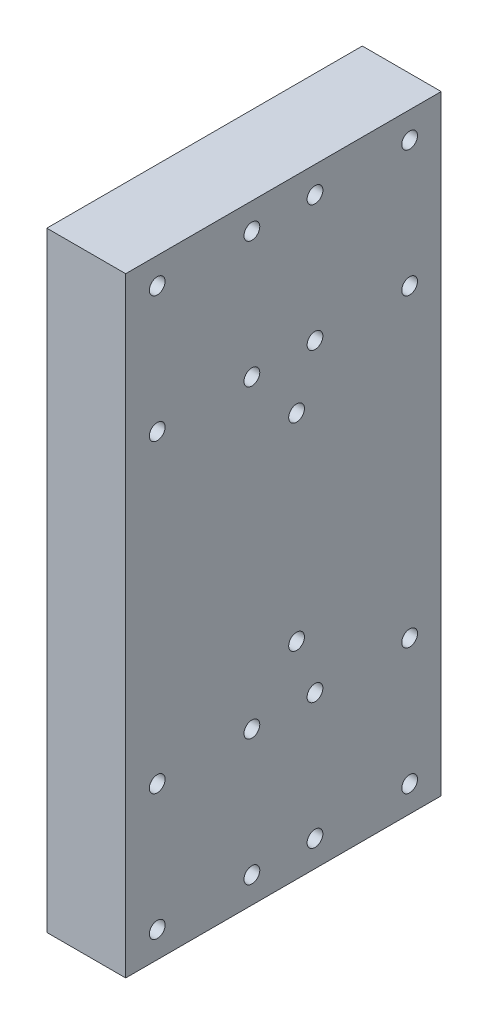
ISO-10303-21;
HEADER;
FILE_DESCRIPTION(('STEP AP214'),'2;1');
FILE_NAME('part.step','',(''),(''),'','','');
FILE_SCHEMA(('AUTOMOTIVE_DESIGN { 1 0 10303 214 1 1 1 1 }'));
ENDSEC;
DATA;
#1=APPLICATION_CONTEXT('core data for automotive mechanical design processes');
#2=APPLICATION_PROTOCOL_DEFINITION('international standard','automotive_design',2000,#1);
#3=PRODUCT_CONTEXT('',#1,'mechanical');
#4=PRODUCT('Part','Part','',(#3));
#5=PRODUCT_RELATED_PRODUCT_CATEGORY('part','',(#4));
#6=PRODUCT_DEFINITION_FORMATION('','',#4);
#7=PRODUCT_DEFINITION_CONTEXT('part definition',#1,'design');
#8=PRODUCT_DEFINITION('design','',#6,#7);
#9=PRODUCT_DEFINITION_SHAPE('','',#8);
#10=(LENGTH_UNIT() NAMED_UNIT(*) SI_UNIT(.MILLI.,.METRE.));
#11=(NAMED_UNIT(*) PLANE_ANGLE_UNIT() SI_UNIT($,.RADIAN.));
#12=(NAMED_UNIT(*) SI_UNIT($,.STERADIAN.) SOLID_ANGLE_UNIT());
#13=UNCERTAINTY_MEASURE_WITH_UNIT(LENGTH_MEASURE(1.E-05),#10,'distance_accuracy_value','');
#14=(GEOMETRIC_REPRESENTATION_CONTEXT(3) GLOBAL_UNCERTAINTY_ASSIGNED_CONTEXT((#13)) GLOBAL_UNIT_ASSIGNED_CONTEXT((#10,
#11,#12)) REPRESENTATION_CONTEXT('',''));
#15=CARTESIAN_POINT('',(0.,0.,0.));
#16=DIRECTION('',(0.,0.,1.));
#17=DIRECTION('',(1.,0.,0.));
#18=AXIS2_PLACEMENT_3D('',#15,#16,#17);
#19=CARTESIAN_POINT('',(15.,0.,0.));
#20=DIRECTION('',(-1.,0.,0.));
#21=DIRECTION('',(0.,0.,1.));
#22=AXIS2_PLACEMENT_3D('',#19,#20,#21);
#23=PLANE('',#22);
#24=CARTESIAN_POINT('',(15.,76.8,-32.5));
#25=DIRECTION('',(1.,0.,0.));
#26=DIRECTION('',(0.,0.,-1.));
#27=AXIS2_PLACEMENT_3D('',#24,#25,#26);
#28=CIRCLE('',#27,1.5);
#29=CARTESIAN_POINT('',(15.,76.8,-34.));
#30=VERTEX_POINT('',#29);
#31=EDGE_CURVE('E205',#30,#30,#28,.T.);
#32=ORIENTED_EDGE('',*,*,#31,.F.);
#33=EDGE_LOOP('',(#32));
#34=FACE_BOUND('',#33,.T.);
#35=CARTESIAN_POINT('',(15.,111.,-54.));
#36=DIRECTION('',(1.,0.,0.));
#37=DIRECTION('',(0.,0.,1.));
#38=AXIS2_PLACEMENT_3D('',#35,#36,#37);
#39=CIRCLE('',#38,1.5);
#40=CARTESIAN_POINT('',(15.,111.,-52.5));
#41=VERTEX_POINT('',#40);
#42=EDGE_CURVE('E193',#41,#41,#39,.T.);
#43=ORIENTED_EDGE('',*,*,#42,.F.);
#44=EDGE_LOOP('',(#43));
#45=FACE_BOUND('',#44,.T.);
#46=CARTESIAN_POINT('',(15.,87.,-36.));
#47=DIRECTION('',(1.,0.,0.));
#48=DIRECTION('',(0.,0.,1.));
#49=AXIS2_PLACEMENT_3D('',#46,#47,#48);
#50=CIRCLE('',#49,1.5);
#51=CARTESIAN_POINT('',(15.,87.,-34.5));
#52=VERTEX_POINT('',#51);
#53=EDGE_CURVE('E181',#52,#52,#50,.T.);
#54=ORIENTED_EDGE('',*,*,#53,.F.);
#55=EDGE_LOOP('',(#54));
#56=FACE_BOUND('',#55,.T.);
#57=CARTESIAN_POINT('',(15.,111.,-24.));
#58=DIRECTION('',(1.,0.,0.));
#59=DIRECTION('',(0.,0.,-1.));
#60=AXIS2_PLACEMENT_3D('',#57,#58,#59);
#61=CIRCLE('',#60,1.5);
#62=CARTESIAN_POINT('',(15.,111.,-25.5));
#63=VERTEX_POINT('',#62);
#64=EDGE_CURVE('E169',#63,#63,#61,.T.);
#65=ORIENTED_EDGE('',*,*,#64,.F.);
#66=EDGE_LOOP('',(#65));
#67=FACE_BOUND('',#66,.T.);
#68=CARTESIAN_POINT('',(15.,87.,-6.));
#69=DIRECTION('',(1.,0.,0.));
#70=DIRECTION('',(0.,0.,-1.));
#71=AXIS2_PLACEMENT_3D('',#68,#69,#70);
#72=CIRCLE('',#71,1.5);
#73=CARTESIAN_POINT('',(15.,87.,-7.5));
#74=VERTEX_POINT('',#73);
#75=EDGE_CURVE('E157',#74,#74,#72,.T.);
#76=ORIENTED_EDGE('',*,*,#75,.F.);
#77=EDGE_LOOP('',(#76));
#78=FACE_BOUND('',#77,.T.);
#79=CARTESIAN_POINT('',(15.,5.,-6.));
#80=DIRECTION('',(1.,0.,0.));
#81=DIRECTION('',(0.,0.,1.));
#82=AXIS2_PLACEMENT_3D('',#79,#80,#81);
#83=CIRCLE('',#82,1.5);
#84=CARTESIAN_POINT('',(15.,5.,-4.49999999999999));
#85=VERTEX_POINT('',#84);
#86=EDGE_CURVE('E145',#85,#85,#83,.T.);
#87=ORIENTED_EDGE('',*,*,#86,.F.);
#88=EDGE_LOOP('',(#87));
#89=FACE_BOUND('',#88,.T.);
#90=CARTESIAN_POINT('',(15.,29.,-24.));
#91=DIRECTION('',(1.,0.,0.));
#92=DIRECTION('',(0.,0.,1.));
#93=AXIS2_PLACEMENT_3D('',#90,#91,#92);
#94=CIRCLE('',#93,1.5);
#95=CARTESIAN_POINT('',(15.,29.,-22.5));
#96=VERTEX_POINT('',#95);
#97=EDGE_CURVE('E133',#96,#96,#94,.T.);
#98=ORIENTED_EDGE('',*,*,#97,.F.);
#99=EDGE_LOOP('',(#98));
#100=FACE_BOUND('',#99,.T.);
#101=CARTESIAN_POINT('',(15.,29.,-36.));
#102=DIRECTION('',(1.,0.,0.));
#103=DIRECTION('',(0.,0.,-1.));
#104=AXIS2_PLACEMENT_3D('',#101,#102,#103);
#105=CIRCLE('',#104,1.5);
#106=CARTESIAN_POINT('',(15.,29.,-37.5));
#107=VERTEX_POINT('',#106);
#108=EDGE_CURVE('E121',#107,#107,#105,.T.);
#109=ORIENTED_EDGE('',*,*,#108,.F.);
#110=EDGE_LOOP('',(#109));
#111=FACE_BOUND('',#110,.T.);
#112=CARTESIAN_POINT('',(15.,5.,-54.));
#113=DIRECTION('',(1.,0.,0.));
#114=DIRECTION('',(0.,0.,-1.));
#115=AXIS2_PLACEMENT_3D('',#112,#113,#114);
#116=CIRCLE('',#115,1.5);
#117=CARTESIAN_POINT('',(15.,5.,-55.5));
#118=VERTEX_POINT('',#117);
#119=EDGE_CURVE('E100',#118,#118,#116,.T.);
#120=ORIENTED_EDGE('',*,*,#119,.F.);
#121=EDGE_LOOP('',(#120));
#122=FACE_BOUND('',#121,.T.);
#123=DIRECTION('',(0.,-1.,0.));
#124=VECTOR('',#123,1.);
#125=CARTESIAN_POINT('',(15.,0.,0.));
#126=LINE('',#125,#124);
#127=CARTESIAN_POINT('',(15.,116.,0.));
#128=VERTEX_POINT('',#127);
#129=CARTESIAN_POINT('',(15.,0.,0.));
#130=VERTEX_POINT('',#129);
#131=EDGE_CURVE('E85',#128,#130,#126,.T.);
#132=ORIENTED_EDGE('',*,*,#131,.T.);
#133=DIRECTION('',(0.,0.,-1.));
#134=VECTOR('',#133,1.);
#135=CARTESIAN_POINT('',(15.,0.,0.));
#136=LINE('',#135,#134);
#137=CARTESIAN_POINT('',(15.,0.,-60.));
#138=VERTEX_POINT('',#137);
#139=EDGE_CURVE('E80',#130,#138,#136,.T.);
#140=ORIENTED_EDGE('',*,*,#139,.T.);
#141=DIRECTION('',(0.,1.,0.));
#142=VECTOR('',#141,1.);
#143=CARTESIAN_POINT('',(15.,0.,-60.));
#144=LINE('',#143,#142);
#145=CARTESIAN_POINT('',(15.,116.,-60.));
#146=VERTEX_POINT('',#145);
#147=EDGE_CURVE('E83',#138,#146,#144,.T.);
#148=ORIENTED_EDGE('',*,*,#147,.T.);
#149=DIRECTION('',(0.,0.,1.));
#150=VECTOR('',#149,1.);
#151=CARTESIAN_POINT('',(15.,116.,0.));
#152=LINE('',#151,#150);
#153=EDGE_CURVE('E50',#146,#128,#152,.T.);
#154=ORIENTED_EDGE('',*,*,#153,.T.);
#155=EDGE_LOOP('',(#132,#140,#148,#154));
#156=FACE_BOUND('',#155,.T.);
#157=CARTESIAN_POINT('',(15.,5.,-36.));
#158=DIRECTION('',(1.,0.,0.));
#159=DIRECTION('',(0.,0.,-1.));
#160=AXIS2_PLACEMENT_3D('',#157,#158,#159);
#161=CIRCLE('',#160,1.5);
#162=CARTESIAN_POINT('',(15.,5.,-37.5));
#163=VERTEX_POINT('',#162);
#164=EDGE_CURVE('E115',#163,#163,#161,.T.);
#165=ORIENTED_EDGE('',*,*,#164,.F.);
#166=EDGE_LOOP('',(#165));
#167=FACE_BOUND('',#166,.T.);
#168=CARTESIAN_POINT('',(15.,29.,-54.));
#169=DIRECTION('',(1.,0.,0.));
#170=DIRECTION('',(0.,0.,-1.));
#171=AXIS2_PLACEMENT_3D('',#168,#169,#170);
#172=CIRCLE('',#171,1.5);
#173=CARTESIAN_POINT('',(15.,29.,-55.5));
#174=VERTEX_POINT('',#173);
#175=EDGE_CURVE('E127',#174,#174,#172,.T.);
#176=ORIENTED_EDGE('',*,*,#175,.F.);
#177=EDGE_LOOP('',(#176));
#178=FACE_BOUND('',#177,.T.);
#179=CARTESIAN_POINT('',(15.,5.,-24.));
#180=DIRECTION('',(1.,0.,0.));
#181=DIRECTION('',(0.,0.,1.));
#182=AXIS2_PLACEMENT_3D('',#179,#180,#181);
#183=CIRCLE('',#182,1.5);
#184=CARTESIAN_POINT('',(15.,5.,-22.5));
#185=VERTEX_POINT('',#184);
#186=EDGE_CURVE('E139',#185,#185,#183,.T.);
#187=ORIENTED_EDGE('',*,*,#186,.F.);
#188=EDGE_LOOP('',(#187));
#189=FACE_BOUND('',#188,.T.);
#190=CARTESIAN_POINT('',(15.,29.,-6.));
#191=DIRECTION('',(1.,0.,0.));
#192=DIRECTION('',(0.,0.,1.));
#193=AXIS2_PLACEMENT_3D('',#190,#191,#192);
#194=CIRCLE('',#193,1.5);
#195=CARTESIAN_POINT('',(15.,29.,-4.49999999999999));
#196=VERTEX_POINT('',#195);
#197=EDGE_CURVE('E151',#196,#196,#194,.T.);
#198=ORIENTED_EDGE('',*,*,#197,.F.);
#199=EDGE_LOOP('',(#198));
#200=FACE_BOUND('',#199,.T.);
#201=CARTESIAN_POINT('',(15.,111.,-6.));
#202=DIRECTION('',(1.,0.,0.));
#203=DIRECTION('',(0.,0.,-1.));
#204=AXIS2_PLACEMENT_3D('',#201,#202,#203);
#205=CIRCLE('',#204,1.5);
#206=CARTESIAN_POINT('',(15.,111.,-7.5));
#207=VERTEX_POINT('',#206);
#208=EDGE_CURVE('E163',#207,#207,#205,.T.);
#209=ORIENTED_EDGE('',*,*,#208,.F.);
#210=EDGE_LOOP('',(#209));
#211=FACE_BOUND('',#210,.T.);
#212=CARTESIAN_POINT('',(15.,87.,-24.));
#213=DIRECTION('',(1.,0.,0.));
#214=DIRECTION('',(0.,0.,-1.));
#215=AXIS2_PLACEMENT_3D('',#212,#213,#214);
#216=CIRCLE('',#215,1.5);
#217=CARTESIAN_POINT('',(15.,87.,-25.5));
#218=VERTEX_POINT('',#217);
#219=EDGE_CURVE('E175',#218,#218,#216,.T.);
#220=ORIENTED_EDGE('',*,*,#219,.F.);
#221=EDGE_LOOP('',(#220));
#222=FACE_BOUND('',#221,.T.);
#223=CARTESIAN_POINT('',(15.,111.,-36.));
#224=DIRECTION('',(1.,0.,0.));
#225=DIRECTION('',(0.,0.,1.));
#226=AXIS2_PLACEMENT_3D('',#223,#224,#225);
#227=CIRCLE('',#226,1.5);
#228=CARTESIAN_POINT('',(15.,111.,-34.5));
#229=VERTEX_POINT('',#228);
#230=EDGE_CURVE('E187',#229,#229,#227,.T.);
#231=ORIENTED_EDGE('',*,*,#230,.F.);
#232=EDGE_LOOP('',(#231));
#233=FACE_BOUND('',#232,.T.);
#234=CARTESIAN_POINT('',(15.,87.,-54.));
#235=DIRECTION('',(1.,0.,0.));
#236=DIRECTION('',(0.,0.,1.));
#237=AXIS2_PLACEMENT_3D('',#234,#235,#236);
#238=CIRCLE('',#237,1.5);
#239=CARTESIAN_POINT('',(15.,87.,-52.5));
#240=VERTEX_POINT('',#239);
#241=EDGE_CURVE('E199',#240,#240,#238,.T.);
#242=ORIENTED_EDGE('',*,*,#241,.F.);
#243=EDGE_LOOP('',(#242));
#244=FACE_BOUND('',#243,.T.);
#245=CARTESIAN_POINT('',(15.,39.2,-32.5));
#246=DIRECTION('',(1.,0.,0.));
#247=DIRECTION('',(0.,0.,-1.));
#248=AXIS2_PLACEMENT_3D('',#245,#246,#247);
#249=CIRCLE('',#248,1.5);
#250=CARTESIAN_POINT('',(15.,39.2,-34.));
#251=VERTEX_POINT('',#250);
#252=EDGE_CURVE('E211',#251,#251,#249,.T.);
#253=ORIENTED_EDGE('',*,*,#252,.F.);
#254=EDGE_LOOP('',(#253));
#255=FACE_BOUND('',#254,.T.);
#256=ADVANCED_FACE('F33',(#34,#45,#56,#67,#78,#89,#100,#111,#122,#156,#167,#178,#189,#200,#211,
#222,#233,#244,#255),#23,.F.);
#257=CARTESIAN_POINT('',(0.,0.,0.));
#258=DIRECTION('',(-1.,0.,0.));
#259=DIRECTION('',(0.,0.,1.));
#260=AXIS2_PLACEMENT_3D('',#257,#258,#259);
#261=PLANE('',#260);
#262=CARTESIAN_POINT('',(0.,76.8,-32.5));
#263=DIRECTION('',(1.,0.,0.));
#264=DIRECTION('',(0.,0.,-1.));
#265=AXIS2_PLACEMENT_3D('',#262,#263,#264);
#266=CIRCLE('',#265,1.5);
#267=CARTESIAN_POINT('',(0.,76.8,-34.));
#268=VERTEX_POINT('',#267);
#269=EDGE_CURVE('E208',#268,#268,#266,.T.);
#270=ORIENTED_EDGE('',*,*,#269,.T.);
#271=EDGE_LOOP('',(#270));
#272=FACE_BOUND('',#271,.T.);
#273=CARTESIAN_POINT('',(0.,111.,-54.));
#274=DIRECTION('',(1.,0.,0.));
#275=DIRECTION('',(0.,0.,1.));
#276=AXIS2_PLACEMENT_3D('',#273,#274,#275);
#277=CIRCLE('',#276,1.5);
#278=CARTESIAN_POINT('',(0.,111.,-52.5));
#279=VERTEX_POINT('',#278);
#280=EDGE_CURVE('E196',#279,#279,#277,.T.);
#281=ORIENTED_EDGE('',*,*,#280,.T.);
#282=EDGE_LOOP('',(#281));
#283=FACE_BOUND('',#282,.T.);
#284=CARTESIAN_POINT('',(0.,87.,-36.));
#285=DIRECTION('',(1.,0.,0.));
#286=DIRECTION('',(0.,0.,1.));
#287=AXIS2_PLACEMENT_3D('',#284,#285,#286);
#288=CIRCLE('',#287,1.5);
#289=CARTESIAN_POINT('',(0.,87.,-34.5));
#290=VERTEX_POINT('',#289);
#291=EDGE_CURVE('E184',#290,#290,#288,.T.);
#292=ORIENTED_EDGE('',*,*,#291,.T.);
#293=EDGE_LOOP('',(#292));
#294=FACE_BOUND('',#293,.T.);
#295=CARTESIAN_POINT('',(0.,111.,-24.));
#296=DIRECTION('',(1.,0.,0.));
#297=DIRECTION('',(0.,0.,-1.));
#298=AXIS2_PLACEMENT_3D('',#295,#296,#297);
#299=CIRCLE('',#298,1.5);
#300=CARTESIAN_POINT('',(0.,111.,-25.5));
#301=VERTEX_POINT('',#300);
#302=EDGE_CURVE('E172',#301,#301,#299,.T.);
#303=ORIENTED_EDGE('',*,*,#302,.T.);
#304=EDGE_LOOP('',(#303));
#305=FACE_BOUND('',#304,.T.);
#306=CARTESIAN_POINT('',(0.,87.,-6.));
#307=DIRECTION('',(1.,0.,0.));
#308=DIRECTION('',(0.,0.,-1.));
#309=AXIS2_PLACEMENT_3D('',#306,#307,#308);
#310=CIRCLE('',#309,1.5);
#311=CARTESIAN_POINT('',(0.,87.,-7.5));
#312=VERTEX_POINT('',#311);
#313=EDGE_CURVE('E160',#312,#312,#310,.T.);
#314=ORIENTED_EDGE('',*,*,#313,.T.);
#315=EDGE_LOOP('',(#314));
#316=FACE_BOUND('',#315,.T.);
#317=CARTESIAN_POINT('',(0.,5.,-6.));
#318=DIRECTION('',(1.,0.,0.));
#319=DIRECTION('',(0.,0.,1.));
#320=AXIS2_PLACEMENT_3D('',#317,#318,#319);
#321=CIRCLE('',#320,1.5);
#322=CARTESIAN_POINT('',(0.,5.,-4.49999999999999));
#323=VERTEX_POINT('',#322);
#324=EDGE_CURVE('E148',#323,#323,#321,.T.);
#325=ORIENTED_EDGE('',*,*,#324,.T.);
#326=EDGE_LOOP('',(#325));
#327=FACE_BOUND('',#326,.T.);
#328=CARTESIAN_POINT('',(0.,29.,-24.));
#329=DIRECTION('',(1.,0.,0.));
#330=DIRECTION('',(0.,0.,1.));
#331=AXIS2_PLACEMENT_3D('',#328,#329,#330);
#332=CIRCLE('',#331,1.5);
#333=CARTESIAN_POINT('',(0.,29.,-22.5));
#334=VERTEX_POINT('',#333);
#335=EDGE_CURVE('E136',#334,#334,#332,.T.);
#336=ORIENTED_EDGE('',*,*,#335,.T.);
#337=EDGE_LOOP('',(#336));
#338=FACE_BOUND('',#337,.T.);
#339=CARTESIAN_POINT('',(0.,29.,-36.));
#340=DIRECTION('',(1.,0.,0.));
#341=DIRECTION('',(0.,0.,-1.));
#342=AXIS2_PLACEMENT_3D('',#339,#340,#341);
#343=CIRCLE('',#342,1.5);
#344=CARTESIAN_POINT('',(0.,29.,-37.5));
#345=VERTEX_POINT('',#344);
#346=EDGE_CURVE('E124',#345,#345,#343,.T.);
#347=ORIENTED_EDGE('',*,*,#346,.T.);
#348=EDGE_LOOP('',(#347));
#349=FACE_BOUND('',#348,.T.);
#350=CARTESIAN_POINT('',(0.,5.,-54.));
#351=DIRECTION('',(1.,0.,0.));
#352=DIRECTION('',(0.,0.,-1.));
#353=AXIS2_PLACEMENT_3D('',#350,#351,#352);
#354=CIRCLE('',#353,1.5);
#355=CARTESIAN_POINT('',(0.,5.,-55.5));
#356=VERTEX_POINT('',#355);
#357=EDGE_CURVE('E112',#356,#356,#354,.T.);
#358=ORIENTED_EDGE('',*,*,#357,.T.);
#359=EDGE_LOOP('',(#358));
#360=FACE_BOUND('',#359,.T.);
#361=DIRECTION('',(0.,-1.,0.));
#362=VECTOR('',#361,1.);
#363=CARTESIAN_POINT('',(0.,0.,0.));
#364=LINE('',#363,#362);
#365=CARTESIAN_POINT('',(0.,116.,0.));
#366=VERTEX_POINT('',#365);
#367=CARTESIAN_POINT('',(0.,0.,0.));
#368=VERTEX_POINT('',#367);
#369=EDGE_CURVE('E97',#366,#368,#364,.T.);
#370=ORIENTED_EDGE('',*,*,#369,.F.);
#371=DIRECTION('',(0.,0.,1.));
#372=VECTOR('',#371,1.);
#373=CARTESIAN_POINT('',(0.,116.,0.));
#374=LINE('',#373,#372);
#375=CARTESIAN_POINT('',(0.,116.,-60.));
#376=VERTEX_POINT('',#375);
#377=EDGE_CURVE('E73',#376,#366,#374,.T.);
#378=ORIENTED_EDGE('',*,*,#377,.F.);
#379=DIRECTION('',(0.,1.,0.));
#380=VECTOR('',#379,1.);
#381=CARTESIAN_POINT('',(0.,0.,-60.));
#382=LINE('',#381,#380);
#383=CARTESIAN_POINT('',(0.,0.,-60.));
#384=VERTEX_POINT('',#383);
#385=EDGE_CURVE('E67',#384,#376,#382,.T.);
#386=ORIENTED_EDGE('',*,*,#385,.F.);
#387=DIRECTION('',(0.,0.,-1.));
#388=VECTOR('',#387,1.);
#389=CARTESIAN_POINT('',(0.,0.,0.));
#390=LINE('',#389,#388);
#391=EDGE_CURVE('E89',#368,#384,#390,.T.);
#392=ORIENTED_EDGE('',*,*,#391,.F.);
#393=EDGE_LOOP('',(#370,#378,#386,#392));
#394=FACE_BOUND('',#393,.T.);
#395=CARTESIAN_POINT('',(0.,5.,-36.));
#396=DIRECTION('',(1.,0.,0.));
#397=DIRECTION('',(0.,0.,-1.));
#398=AXIS2_PLACEMENT_3D('',#395,#396,#397);
#399=CIRCLE('',#398,1.5);
#400=CARTESIAN_POINT('',(0.,5.,-37.5));
#401=VERTEX_POINT('',#400);
#402=EDGE_CURVE('E118',#401,#401,#399,.T.);
#403=ORIENTED_EDGE('',*,*,#402,.T.);
#404=EDGE_LOOP('',(#403));
#405=FACE_BOUND('',#404,.T.);
#406=CARTESIAN_POINT('',(0.,29.,-54.));
#407=DIRECTION('',(1.,0.,0.));
#408=DIRECTION('',(0.,0.,-1.));
#409=AXIS2_PLACEMENT_3D('',#406,#407,#408);
#410=CIRCLE('',#409,1.5);
#411=CARTESIAN_POINT('',(0.,29.,-55.5));
#412=VERTEX_POINT('',#411);
#413=EDGE_CURVE('E130',#412,#412,#410,.T.);
#414=ORIENTED_EDGE('',*,*,#413,.T.);
#415=EDGE_LOOP('',(#414));
#416=FACE_BOUND('',#415,.T.);
#417=CARTESIAN_POINT('',(0.,5.,-24.));
#418=DIRECTION('',(1.,0.,0.));
#419=DIRECTION('',(0.,0.,1.));
#420=AXIS2_PLACEMENT_3D('',#417,#418,#419);
#421=CIRCLE('',#420,1.5);
#422=CARTESIAN_POINT('',(0.,5.,-22.5));
#423=VERTEX_POINT('',#422);
#424=EDGE_CURVE('E142',#423,#423,#421,.T.);
#425=ORIENTED_EDGE('',*,*,#424,.T.);
#426=EDGE_LOOP('',(#425));
#427=FACE_BOUND('',#426,.T.);
#428=CARTESIAN_POINT('',(0.,29.,-6.));
#429=DIRECTION('',(1.,0.,0.));
#430=DIRECTION('',(0.,0.,1.));
#431=AXIS2_PLACEMENT_3D('',#428,#429,#430);
#432=CIRCLE('',#431,1.5);
#433=CARTESIAN_POINT('',(0.,29.,-4.49999999999999));
#434=VERTEX_POINT('',#433);
#435=EDGE_CURVE('E154',#434,#434,#432,.T.);
#436=ORIENTED_EDGE('',*,*,#435,.T.);
#437=EDGE_LOOP('',(#436));
#438=FACE_BOUND('',#437,.T.);
#439=CARTESIAN_POINT('',(0.,111.,-6.));
#440=DIRECTION('',(1.,0.,0.));
#441=DIRECTION('',(0.,0.,-1.));
#442=AXIS2_PLACEMENT_3D('',#439,#440,#441);
#443=CIRCLE('',#442,1.5);
#444=CARTESIAN_POINT('',(0.,111.,-7.5));
#445=VERTEX_POINT('',#444);
#446=EDGE_CURVE('E166',#445,#445,#443,.T.);
#447=ORIENTED_EDGE('',*,*,#446,.T.);
#448=EDGE_LOOP('',(#447));
#449=FACE_BOUND('',#448,.T.);
#450=CARTESIAN_POINT('',(0.,87.,-24.));
#451=DIRECTION('',(1.,0.,0.));
#452=DIRECTION('',(0.,0.,-1.));
#453=AXIS2_PLACEMENT_3D('',#450,#451,#452);
#454=CIRCLE('',#453,1.5);
#455=CARTESIAN_POINT('',(0.,87.,-25.5));
#456=VERTEX_POINT('',#455);
#457=EDGE_CURVE('E178',#456,#456,#454,.T.);
#458=ORIENTED_EDGE('',*,*,#457,.T.);
#459=EDGE_LOOP('',(#458));
#460=FACE_BOUND('',#459,.T.);
#461=CARTESIAN_POINT('',(0.,111.,-36.));
#462=DIRECTION('',(1.,0.,0.));
#463=DIRECTION('',(0.,0.,1.));
#464=AXIS2_PLACEMENT_3D('',#461,#462,#463);
#465=CIRCLE('',#464,1.5);
#466=CARTESIAN_POINT('',(0.,111.,-34.5));
#467=VERTEX_POINT('',#466);
#468=EDGE_CURVE('E190',#467,#467,#465,.T.);
#469=ORIENTED_EDGE('',*,*,#468,.T.);
#470=EDGE_LOOP('',(#469));
#471=FACE_BOUND('',#470,.T.);
#472=CARTESIAN_POINT('',(0.,87.,-54.));
#473=DIRECTION('',(1.,0.,0.));
#474=DIRECTION('',(0.,0.,1.));
#475=AXIS2_PLACEMENT_3D('',#472,#473,#474);
#476=CIRCLE('',#475,1.5);
#477=CARTESIAN_POINT('',(0.,87.,-52.5));
#478=VERTEX_POINT('',#477);
#479=EDGE_CURVE('E202',#478,#478,#476,.T.);
#480=ORIENTED_EDGE('',*,*,#479,.T.);
#481=EDGE_LOOP('',(#480));
#482=FACE_BOUND('',#481,.T.);
#483=CARTESIAN_POINT('',(0.,39.2,-32.5));
#484=DIRECTION('',(1.,0.,0.));
#485=DIRECTION('',(0.,0.,-1.));
#486=AXIS2_PLACEMENT_3D('',#483,#484,#485);
#487=CIRCLE('',#486,1.5);
#488=CARTESIAN_POINT('',(0.,39.2,-34.));
#489=VERTEX_POINT('',#488);
#490=EDGE_CURVE('E214',#489,#489,#487,.T.);
#491=ORIENTED_EDGE('',*,*,#490,.T.);
#492=EDGE_LOOP('',(#491));
#493=FACE_BOUND('',#492,.T.);
#494=ADVANCED_FACE('F108',(#272,#283,#294,#305,#316,#327,#338,#349,#360,#394,#405,#416,#427,
#438,#449,#460,#471,#482,#493),#261,.T.);
#495=CARTESIAN_POINT('',(15.,0.,0.));
#496=DIRECTION('',(0.,0.,-1.));
#497=DIRECTION('',(-1.,0.,0.));
#498=AXIS2_PLACEMENT_3D('',#495,#496,#497);
#499=PLANE('',#498);
#500=ORIENTED_EDGE('',*,*,#369,.T.);
#501=DIRECTION('',(-1.,0.,0.));
#502=VECTOR('',#501,1.);
#503=CARTESIAN_POINT('',(15.,0.,0.));
#504=LINE('',#503,#502);
#505=EDGE_CURVE('E11',#130,#368,#504,.T.);
#506=ORIENTED_EDGE('',*,*,#505,.F.);
#507=ORIENTED_EDGE('',*,*,#131,.F.);
#508=DIRECTION('',(-1.,0.,0.));
#509=VECTOR('',#508,1.);
#510=CARTESIAN_POINT('',(15.,116.,0.));
#511=LINE('',#510,#509);
#512=EDGE_CURVE('E93',#128,#366,#511,.T.);
#513=ORIENTED_EDGE('',*,*,#512,.T.);
#514=EDGE_LOOP('',(#500,#506,#507,#513));
#515=FACE_BOUND('',#514,.T.);
#516=ADVANCED_FACE('F35',(#515),#499,.F.);
#517=CARTESIAN_POINT('',(15.,0.,0.));
#518=DIRECTION('',(0.,1.,0.));
#519=DIRECTION('',(0.,0.,1.));
#520=AXIS2_PLACEMENT_3D('',#517,#518,#519);
#521=PLANE('',#520);
#522=ORIENTED_EDGE('',*,*,#391,.T.);
#523=DIRECTION('',(-1.,0.,0.));
#524=VECTOR('',#523,1.);
#525=CARTESIAN_POINT('',(15.,0.,-60.));
#526=LINE('',#525,#524);
#527=EDGE_CURVE('E42',#138,#384,#526,.T.);
#528=ORIENTED_EDGE('',*,*,#527,.F.);
#529=ORIENTED_EDGE('',*,*,#139,.F.);
#530=ORIENTED_EDGE('',*,*,#505,.T.);
#531=EDGE_LOOP('',(#522,#528,#529,#530));
#532=FACE_BOUND('',#531,.T.);
#533=ADVANCED_FACE('F88',(#532),#521,.F.);
#534=CARTESIAN_POINT('',(15.,0.,-60.));
#535=DIRECTION('',(0.,0.,1.));
#536=DIRECTION('',(1.,0.,0.));
#537=AXIS2_PLACEMENT_3D('',#534,#535,#536);
#538=PLANE('',#537);
#539=ORIENTED_EDGE('',*,*,#385,.T.);
#540=DIRECTION('',(-1.,0.,0.));
#541=VECTOR('',#540,1.);
#542=CARTESIAN_POINT('',(15.,116.,-60.));
#543=LINE('',#542,#541);
#544=EDGE_CURVE('E90',#146,#376,#543,.T.);
#545=ORIENTED_EDGE('',*,*,#544,.F.);
#546=ORIENTED_EDGE('',*,*,#147,.F.);
#547=ORIENTED_EDGE('',*,*,#527,.T.);
#548=EDGE_LOOP('',(#539,#545,#546,#547));
#549=FACE_BOUND('',#548,.T.);
#550=ADVANCED_FACE('F91',(#549),#538,.F.);
#551=CARTESIAN_POINT('',(15.,116.,0.));
#552=DIRECTION('',(0.,-1.,0.));
#553=DIRECTION('',(0.,0.,-1.));
#554=AXIS2_PLACEMENT_3D('',#551,#552,#553);
#555=PLANE('',#554);
#556=ORIENTED_EDGE('',*,*,#377,.T.);
#557=ORIENTED_EDGE('',*,*,#512,.F.);
#558=ORIENTED_EDGE('',*,*,#153,.F.);
#559=ORIENTED_EDGE('',*,*,#544,.T.);
#560=EDGE_LOOP('',(#556,#557,#558,#559));
#561=FACE_BOUND('',#560,.T.);
#562=ADVANCED_FACE('F105',(#561),#555,.F.);
#563=CARTESIAN_POINT('',(15.,5.,-54.));
#564=DIRECTION('',(-1.,0.,0.));
#565=DIRECTION('',(0.,0.,1.));
#566=AXIS2_PLACEMENT_3D('',#563,#564,#565);
#567=CYLINDRICAL_SURFACE('',#566,1.5);
#568=ORIENTED_EDGE('',*,*,#119,.T.);
#569=EDGE_LOOP('',(#568));
#570=FACE_BOUND('',#569,.T.);
#571=ORIENTED_EDGE('',*,*,#357,.F.);
#572=EDGE_LOOP('',(#571));
#573=FACE_BOUND('',#572,.T.);
#574=ADVANCED_FACE('F234',(#570,#573),#567,.F.);
#575=CARTESIAN_POINT('',(15.,5.,-36.));
#576=DIRECTION('',(-1.,0.,0.));
#577=DIRECTION('',(0.,0.,1.));
#578=AXIS2_PLACEMENT_3D('',#575,#576,#577);
#579=CYLINDRICAL_SURFACE('',#578,1.5);
#580=ORIENTED_EDGE('',*,*,#164,.T.);
#581=EDGE_LOOP('',(#580));
#582=FACE_BOUND('',#581,.T.);
#583=ORIENTED_EDGE('',*,*,#402,.F.);
#584=EDGE_LOOP('',(#583));
#585=FACE_BOUND('',#584,.T.);
#586=ADVANCED_FACE('F280',(#582,#585),#579,.F.);
#587=CARTESIAN_POINT('',(15.,29.,-36.));
#588=DIRECTION('',(-1.,0.,0.));
#589=DIRECTION('',(0.,0.,1.));
#590=AXIS2_PLACEMENT_3D('',#587,#588,#589);
#591=CYLINDRICAL_SURFACE('',#590,1.5);
#592=ORIENTED_EDGE('',*,*,#108,.T.);
#593=EDGE_LOOP('',(#592));
#594=FACE_BOUND('',#593,.T.);
#595=ORIENTED_EDGE('',*,*,#346,.F.);
#596=EDGE_LOOP('',(#595));
#597=FACE_BOUND('',#596,.T.);
#598=ADVANCED_FACE('F288',(#594,#597),#591,.F.);
#599=CARTESIAN_POINT('',(15.,29.,-54.));
#600=DIRECTION('',(-1.,0.,0.));
#601=DIRECTION('',(0.,0.,1.));
#602=AXIS2_PLACEMENT_3D('',#599,#600,#601);
#603=CYLINDRICAL_SURFACE('',#602,1.5);
#604=ORIENTED_EDGE('',*,*,#175,.T.);
#605=EDGE_LOOP('',(#604));
#606=FACE_BOUND('',#605,.T.);
#607=ORIENTED_EDGE('',*,*,#413,.F.);
#608=EDGE_LOOP('',(#607));
#609=FACE_BOUND('',#608,.T.);
#610=ADVANCED_FACE('F296',(#606,#609),#603,.F.);
#611=CARTESIAN_POINT('',(15.,29.,-24.));
#612=DIRECTION('',(-1.,0.,0.));
#613=DIRECTION('',(0.,0.,1.));
#614=AXIS2_PLACEMENT_3D('',#611,#612,#613);
#615=CYLINDRICAL_SURFACE('',#614,1.5);
#616=ORIENTED_EDGE('',*,*,#97,.T.);
#617=EDGE_LOOP('',(#616));
#618=FACE_BOUND('',#617,.T.);
#619=ORIENTED_EDGE('',*,*,#335,.F.);
#620=EDGE_LOOP('',(#619));
#621=FACE_BOUND('',#620,.T.);
#622=ADVANCED_FACE('F305',(#618,#621),#615,.F.);
#623=CARTESIAN_POINT('',(15.,5.,-24.));
#624=DIRECTION('',(-1.,0.,0.));
#625=DIRECTION('',(0.,0.,1.));
#626=AXIS2_PLACEMENT_3D('',#623,#624,#625);
#627=CYLINDRICAL_SURFACE('',#626,1.5);
#628=ORIENTED_EDGE('',*,*,#186,.T.);
#629=EDGE_LOOP('',(#628));
#630=FACE_BOUND('',#629,.T.);
#631=ORIENTED_EDGE('',*,*,#424,.F.);
#632=EDGE_LOOP('',(#631));
#633=FACE_BOUND('',#632,.T.);
#634=ADVANCED_FACE('F314',(#630,#633),#627,.F.);
#635=CARTESIAN_POINT('',(15.,5.,-6.));
#636=DIRECTION('',(-1.,0.,0.));
#637=DIRECTION('',(0.,0.,1.));
#638=AXIS2_PLACEMENT_3D('',#635,#636,#637);
#639=CYLINDRICAL_SURFACE('',#638,1.5);
#640=ORIENTED_EDGE('',*,*,#86,.T.);
#641=EDGE_LOOP('',(#640));
#642=FACE_BOUND('',#641,.T.);
#643=ORIENTED_EDGE('',*,*,#324,.F.);
#644=EDGE_LOOP('',(#643));
#645=FACE_BOUND('',#644,.T.);
#646=ADVANCED_FACE('F323',(#642,#645),#639,.F.);
#647=CARTESIAN_POINT('',(15.,29.,-6.));
#648=DIRECTION('',(-1.,0.,0.));
#649=DIRECTION('',(0.,0.,1.));
#650=AXIS2_PLACEMENT_3D('',#647,#648,#649);
#651=CYLINDRICAL_SURFACE('',#650,1.5);
#652=ORIENTED_EDGE('',*,*,#197,.T.);
#653=EDGE_LOOP('',(#652));
#654=FACE_BOUND('',#653,.T.);
#655=ORIENTED_EDGE('',*,*,#435,.F.);
#656=EDGE_LOOP('',(#655));
#657=FACE_BOUND('',#656,.T.);
#658=ADVANCED_FACE('F332',(#654,#657),#651,.F.);
#659=CARTESIAN_POINT('',(15.,87.,-6.));
#660=DIRECTION('',(-1.,0.,0.));
#661=DIRECTION('',(0.,0.,1.));
#662=AXIS2_PLACEMENT_3D('',#659,#660,#661);
#663=CYLINDRICAL_SURFACE('',#662,1.5);
#664=ORIENTED_EDGE('',*,*,#75,.T.);
#665=EDGE_LOOP('',(#664));
#666=FACE_BOUND('',#665,.T.);
#667=ORIENTED_EDGE('',*,*,#313,.F.);
#668=EDGE_LOOP('',(#667));
#669=FACE_BOUND('',#668,.T.);
#670=ADVANCED_FACE('F341',(#666,#669),#663,.F.);
#671=CARTESIAN_POINT('',(15.,111.,-6.));
#672=DIRECTION('',(-1.,0.,0.));
#673=DIRECTION('',(0.,0.,1.));
#674=AXIS2_PLACEMENT_3D('',#671,#672,#673);
#675=CYLINDRICAL_SURFACE('',#674,1.5);
#676=ORIENTED_EDGE('',*,*,#208,.T.);
#677=EDGE_LOOP('',(#676));
#678=FACE_BOUND('',#677,.T.);
#679=ORIENTED_EDGE('',*,*,#446,.F.);
#680=EDGE_LOOP('',(#679));
#681=FACE_BOUND('',#680,.T.);
#682=ADVANCED_FACE('F350',(#678,#681),#675,.F.);
#683=CARTESIAN_POINT('',(15.,111.,-24.));
#684=DIRECTION('',(-1.,0.,0.));
#685=DIRECTION('',(0.,0.,1.));
#686=AXIS2_PLACEMENT_3D('',#683,#684,#685);
#687=CYLINDRICAL_SURFACE('',#686,1.5);
#688=ORIENTED_EDGE('',*,*,#64,.T.);
#689=EDGE_LOOP('',(#688));
#690=FACE_BOUND('',#689,.T.);
#691=ORIENTED_EDGE('',*,*,#302,.F.);
#692=EDGE_LOOP('',(#691));
#693=FACE_BOUND('',#692,.T.);
#694=ADVANCED_FACE('F359',(#690,#693),#687,.F.);
#695=CARTESIAN_POINT('',(15.,87.,-24.));
#696=DIRECTION('',(-1.,0.,0.));
#697=DIRECTION('',(0.,0.,1.));
#698=AXIS2_PLACEMENT_3D('',#695,#696,#697);
#699=CYLINDRICAL_SURFACE('',#698,1.5);
#700=ORIENTED_EDGE('',*,*,#219,.T.);
#701=EDGE_LOOP('',(#700));
#702=FACE_BOUND('',#701,.T.);
#703=ORIENTED_EDGE('',*,*,#457,.F.);
#704=EDGE_LOOP('',(#703));
#705=FACE_BOUND('',#704,.T.);
#706=ADVANCED_FACE('F368',(#702,#705),#699,.F.);
#707=CARTESIAN_POINT('',(15.,87.,-36.));
#708=DIRECTION('',(-1.,0.,0.));
#709=DIRECTION('',(0.,0.,1.));
#710=AXIS2_PLACEMENT_3D('',#707,#708,#709);
#711=CYLINDRICAL_SURFACE('',#710,1.5);
#712=ORIENTED_EDGE('',*,*,#53,.T.);
#713=EDGE_LOOP('',(#712));
#714=FACE_BOUND('',#713,.T.);
#715=ORIENTED_EDGE('',*,*,#291,.F.);
#716=EDGE_LOOP('',(#715));
#717=FACE_BOUND('',#716,.T.);
#718=ADVANCED_FACE('F377',(#714,#717),#711,.F.);
#719=CARTESIAN_POINT('',(15.,111.,-36.));
#720=DIRECTION('',(-1.,0.,0.));
#721=DIRECTION('',(0.,0.,1.));
#722=AXIS2_PLACEMENT_3D('',#719,#720,#721);
#723=CYLINDRICAL_SURFACE('',#722,1.5);
#724=ORIENTED_EDGE('',*,*,#230,.T.);
#725=EDGE_LOOP('',(#724));
#726=FACE_BOUND('',#725,.T.);
#727=ORIENTED_EDGE('',*,*,#468,.F.);
#728=EDGE_LOOP('',(#727));
#729=FACE_BOUND('',#728,.T.);
#730=ADVANCED_FACE('F386',(#726,#729),#723,.F.);
#731=CARTESIAN_POINT('',(15.,111.,-54.));
#732=DIRECTION('',(-1.,0.,0.));
#733=DIRECTION('',(0.,0.,1.));
#734=AXIS2_PLACEMENT_3D('',#731,#732,#733);
#735=CYLINDRICAL_SURFACE('',#734,1.5);
#736=ORIENTED_EDGE('',*,*,#42,.T.);
#737=EDGE_LOOP('',(#736));
#738=FACE_BOUND('',#737,.T.);
#739=ORIENTED_EDGE('',*,*,#280,.F.);
#740=EDGE_LOOP('',(#739));
#741=FACE_BOUND('',#740,.T.);
#742=ADVANCED_FACE('F395',(#738,#741),#735,.F.);
#743=CARTESIAN_POINT('',(15.,87.,-54.));
#744=DIRECTION('',(-1.,0.,0.));
#745=DIRECTION('',(0.,0.,1.));
#746=AXIS2_PLACEMENT_3D('',#743,#744,#745);
#747=CYLINDRICAL_SURFACE('',#746,1.5);
#748=ORIENTED_EDGE('',*,*,#241,.T.);
#749=EDGE_LOOP('',(#748));
#750=FACE_BOUND('',#749,.T.);
#751=ORIENTED_EDGE('',*,*,#479,.F.);
#752=EDGE_LOOP('',(#751));
#753=FACE_BOUND('',#752,.T.);
#754=ADVANCED_FACE('F404',(#750,#753),#747,.F.);
#755=CARTESIAN_POINT('',(15.,76.8,-32.5));
#756=DIRECTION('',(-1.,0.,0.));
#757=DIRECTION('',(0.,0.,1.));
#758=AXIS2_PLACEMENT_3D('',#755,#756,#757);
#759=CYLINDRICAL_SURFACE('',#758,1.5);
#760=ORIENTED_EDGE('',*,*,#31,.T.);
#761=EDGE_LOOP('',(#760));
#762=FACE_BOUND('',#761,.T.);
#763=ORIENTED_EDGE('',*,*,#269,.F.);
#764=EDGE_LOOP('',(#763));
#765=FACE_BOUND('',#764,.T.);
#766=ADVANCED_FACE('F413',(#762,#765),#759,.F.);
#767=CARTESIAN_POINT('',(15.,39.2,-32.5));
#768=DIRECTION('',(-1.,0.,0.));
#769=DIRECTION('',(0.,0.,1.));
#770=AXIS2_PLACEMENT_3D('',#767,#768,#769);
#771=CYLINDRICAL_SURFACE('',#770,1.5);
#772=ORIENTED_EDGE('',*,*,#252,.T.);
#773=EDGE_LOOP('',(#772));
#774=FACE_BOUND('',#773,.T.);
#775=ORIENTED_EDGE('',*,*,#490,.F.);
#776=EDGE_LOOP('',(#775));
#777=FACE_BOUND('',#776,.T.);
#778=ADVANCED_FACE('F220',(#774,#777),#771,.F.);
#779=CLOSED_SHELL('',(#256,#494,#516,#533,#550,#562,#574,#586,#598,#610,#622,#634,#646,#658,
#670,#682,#694,#706,#718,#730,#742,#754,#766,#778));
#780=MANIFOLD_SOLID_BREP('B2',#779);
#781=ADVANCED_BREP_SHAPE_REPRESENTATION('',(#18,#780),#14);
#782=SHAPE_DEFINITION_REPRESENTATION(#9,#781);
ENDSEC;
END-ISO-10303-21;
